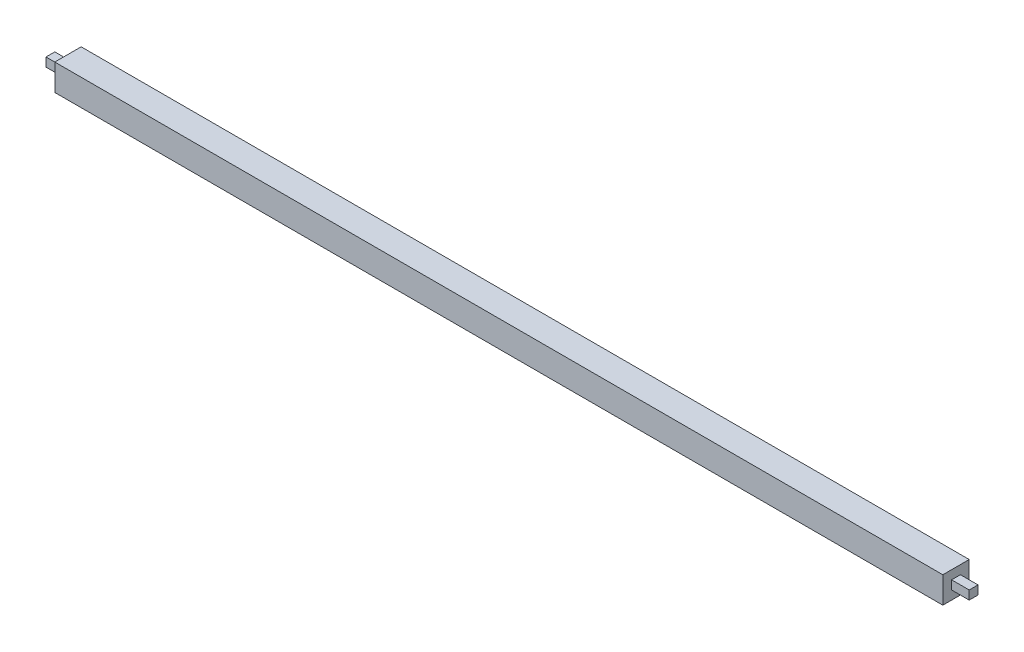
ISO-10303-21;
HEADER;
FILE_DESCRIPTION(('STEP AP214'),'2;1');
FILE_NAME('part.step','',(''),(''),'','','');
FILE_SCHEMA(('AUTOMOTIVE_DESIGN { 1 0 10303 214 1 1 1 1 }'));
ENDSEC;
DATA;
#1=APPLICATION_CONTEXT('core data for automotive mechanical design processes');
#2=APPLICATION_PROTOCOL_DEFINITION('international standard','automotive_design',2000,#1);
#3=PRODUCT_CONTEXT('',#1,'mechanical');
#4=PRODUCT('Part','Part','',(#3));
#5=PRODUCT_RELATED_PRODUCT_CATEGORY('part','',(#4));
#6=PRODUCT_DEFINITION_FORMATION('','',#4);
#7=PRODUCT_DEFINITION_CONTEXT('part definition',#1,'design');
#8=PRODUCT_DEFINITION('design','',#6,#7);
#9=PRODUCT_DEFINITION_SHAPE('','',#8);
#10=(LENGTH_UNIT() NAMED_UNIT(*) SI_UNIT(.MILLI.,.METRE.));
#11=(NAMED_UNIT(*) PLANE_ANGLE_UNIT() SI_UNIT($,.RADIAN.));
#12=(NAMED_UNIT(*) SI_UNIT($,.STERADIAN.) SOLID_ANGLE_UNIT());
#13=UNCERTAINTY_MEASURE_WITH_UNIT(LENGTH_MEASURE(1.E-05),#10,'distance_accuracy_value','');
#14=(GEOMETRIC_REPRESENTATION_CONTEXT(3) GLOBAL_UNCERTAINTY_ASSIGNED_CONTEXT((#13)) GLOBAL_UNIT_ASSIGNED_CONTEXT((#10,
#11,#12)) REPRESENTATION_CONTEXT('',''));
#15=CARTESIAN_POINT('',(0.,0.,0.));
#16=DIRECTION('',(0.,0.,1.));
#17=DIRECTION('',(1.,0.,0.));
#18=AXIS2_PLACEMENT_3D('',#15,#16,#17);
#19=CARTESIAN_POINT('',(202.,6.,0.));
#20=DIRECTION('',(-1.,0.,0.));
#21=DIRECTION('',(0.,0.,1.));
#22=AXIS2_PLACEMENT_3D('',#19,#20,#21);
#23=PLANE('',#22);
#24=DIRECTION('',(0.,0.,-1.));
#25=VECTOR('',#24,1.);
#26=CARTESIAN_POINT('',(202.,0.,0.));
#27=LINE('',#26,#25);
#28=CARTESIAN_POINT('',(202.,0.,0.));
#29=VERTEX_POINT('',#28);
#30=CARTESIAN_POINT('',(202.,0.,-6.00000000000003));
#31=VERTEX_POINT('',#30);
#32=EDGE_CURVE('E196',#29,#31,#27,.T.);
#33=ORIENTED_EDGE('',*,*,#32,.T.);
#34=DIRECTION('',(0.,-1.,0.));
#35=VECTOR('',#34,1.);
#36=CARTESIAN_POINT('',(202.,6.,-6.00000000000003));
#37=LINE('',#36,#35);
#38=CARTESIAN_POINT('',(202.,6.,-6.00000000000003));
#39=VERTEX_POINT('',#38);
#40=EDGE_CURVE('E201',#39,#31,#37,.T.);
#41=ORIENTED_EDGE('',*,*,#40,.F.);
#42=DIRECTION('',(0.,0.,-1.));
#43=VECTOR('',#42,1.);
#44=CARTESIAN_POINT('',(202.,6.,0.));
#45=LINE('',#44,#43);
#46=CARTESIAN_POINT('',(202.,6.,0.));
#47=VERTEX_POINT('',#46);
#48=EDGE_CURVE('E187',#47,#39,#45,.T.);
#49=ORIENTED_EDGE('',*,*,#48,.F.);
#50=DIRECTION('',(0.,-1.,0.));
#51=VECTOR('',#50,1.);
#52=CARTESIAN_POINT('',(202.,6.,0.));
#53=LINE('',#52,#51);
#54=EDGE_CURVE('E41',#47,#29,#53,.T.);
#55=ORIENTED_EDGE('',*,*,#54,.T.);
#56=EDGE_LOOP('',(#33,#41,#49,#55));
#57=FACE_BOUND('',#56,.T.);
#58=DIRECTION('',(0.,-1.,0.));
#59=VECTOR('',#58,1.);
#60=CARTESIAN_POINT('',(202.,4.,-2.00000000000003));
#61=LINE('',#60,#59);
#62=CARTESIAN_POINT('',(202.,4.,-2.00000000000003));
#63=VERTEX_POINT('',#62);
#64=CARTESIAN_POINT('',(202.,2.,-2.00000000000003));
#65=VERTEX_POINT('',#64);
#66=EDGE_CURVE('E48',#63,#65,#61,.T.);
#67=ORIENTED_EDGE('',*,*,#66,.F.);
#68=DIRECTION('',(0.,0.,1.));
#69=VECTOR('',#68,1.);
#70=CARTESIAN_POINT('',(202.,4.,-2.00000000000003));
#71=LINE('',#70,#69);
#72=CARTESIAN_POINT('',(202.,4.,-4.00000000000003));
#73=VERTEX_POINT('',#72);
#74=EDGE_CURVE('E52',#73,#63,#71,.T.);
#75=ORIENTED_EDGE('',*,*,#74,.F.);
#76=DIRECTION('',(0.,1.,0.));
#77=VECTOR('',#76,1.);
#78=CARTESIAN_POINT('',(202.,4.,-4.00000000000003));
#79=LINE('',#78,#77);
#80=CARTESIAN_POINT('',(202.,2.,-4.00000000000003));
#81=VERTEX_POINT('',#80);
#82=EDGE_CURVE('E368',#81,#73,#79,.T.);
#83=ORIENTED_EDGE('',*,*,#82,.F.);
#84=DIRECTION('',(0.,0.,-1.));
#85=VECTOR('',#84,1.);
#86=CARTESIAN_POINT('',(202.,2.,-2.00000000000003));
#87=LINE('',#86,#85);
#88=EDGE_CURVE('E374',#65,#81,#87,.T.);
#89=ORIENTED_EDGE('',*,*,#88,.F.);
#90=EDGE_LOOP('',(#67,#75,#83,#89));
#91=FACE_BOUND('',#90,.T.);
#92=ADVANCED_FACE('F33',(#57,#91),#23,.F.);
#93=CARTESIAN_POINT('',(0.,6.,-6.));
#94=DIRECTION('',(1.,0.,0.));
#95=DIRECTION('',(0.,0.,-1.));
#96=AXIS2_PLACEMENT_3D('',#93,#94,#95);
#97=PLANE('',#96);
#98=DIRECTION('',(0.,0.,1.));
#99=VECTOR('',#98,1.);
#100=CARTESIAN_POINT('',(0.,0.,-6.));
#101=LINE('',#100,#99);
#102=CARTESIAN_POINT('',(0.,0.,-6.));
#103=VERTEX_POINT('',#102);
#104=CARTESIAN_POINT('',(0.,0.,0.));
#105=VERTEX_POINT('',#104);
#106=EDGE_CURVE('E180',#103,#105,#101,.T.);
#107=ORIENTED_EDGE('',*,*,#106,.T.);
#108=DIRECTION('',(0.,-1.,0.));
#109=VECTOR('',#108,1.);
#110=CARTESIAN_POINT('',(0.,6.,0.));
#111=LINE('',#110,#109);
#112=CARTESIAN_POINT('',(0.,6.,0.));
#113=VERTEX_POINT('',#112);
#114=EDGE_CURVE('E11',#113,#105,#111,.T.);
#115=ORIENTED_EDGE('',*,*,#114,.F.);
#116=DIRECTION('',(0.,0.,1.));
#117=VECTOR('',#116,1.);
#118=CARTESIAN_POINT('',(0.,6.,-6.));
#119=LINE('',#118,#117);
#120=CARTESIAN_POINT('',(0.,6.,-6.));
#121=VERTEX_POINT('',#120);
#122=EDGE_CURVE('E181',#121,#113,#119,.T.);
#123=ORIENTED_EDGE('',*,*,#122,.F.);
#124=DIRECTION('',(0.,-1.,0.));
#125=VECTOR('',#124,1.);
#126=CARTESIAN_POINT('',(0.,6.,-6.));
#127=LINE('',#126,#125);
#128=EDGE_CURVE('E191',#121,#103,#127,.T.);
#129=ORIENTED_EDGE('',*,*,#128,.T.);
#130=EDGE_LOOP('',(#107,#115,#123,#129));
#131=FACE_BOUND('',#130,.T.);
#132=DIRECTION('',(0.,-1.,0.));
#133=VECTOR('',#132,1.);
#134=CARTESIAN_POINT('',(0.,4.,-4.));
#135=LINE('',#134,#133);
#136=CARTESIAN_POINT('',(0.,4.,-4.));
#137=VERTEX_POINT('',#136);
#138=CARTESIAN_POINT('',(0.,2.,-4.));
#139=VERTEX_POINT('',#138);
#140=EDGE_CURVE('E142',#137,#139,#135,.T.);
#141=ORIENTED_EDGE('',*,*,#140,.F.);
#142=DIRECTION('',(0.,0.,-1.));
#143=VECTOR('',#142,1.);
#144=CARTESIAN_POINT('',(0.,4.,-4.));
#145=LINE('',#144,#143);
#146=CARTESIAN_POINT('',(0.,4.,-2.));
#147=VERTEX_POINT('',#146);
#148=EDGE_CURVE('E155',#147,#137,#145,.T.);
#149=ORIENTED_EDGE('',*,*,#148,.F.);
#150=DIRECTION('',(0.,1.,0.));
#151=VECTOR('',#150,1.);
#152=CARTESIAN_POINT('',(0.,4.,-2.));
#153=LINE('',#152,#151);
#154=CARTESIAN_POINT('',(0.,2.,-2.));
#155=VERTEX_POINT('',#154);
#156=EDGE_CURVE('E164',#155,#147,#153,.T.);
#157=ORIENTED_EDGE('',*,*,#156,.F.);
#158=DIRECTION('',(0.,0.,1.));
#159=VECTOR('',#158,1.);
#160=CARTESIAN_POINT('',(0.,2.,-4.));
#161=LINE('',#160,#159);
#162=EDGE_CURVE('E145',#139,#155,#161,.T.);
#163=ORIENTED_EDGE('',*,*,#162,.F.);
#164=EDGE_LOOP('',(#141,#149,#157,#163));
#165=FACE_BOUND('',#164,.T.);
#166=ADVANCED_FACE('F35',(#131,#165),#97,.F.);
#167=CARTESIAN_POINT('',(0.,6.,0.));
#168=DIRECTION('',(0.,0.,-1.));
#169=DIRECTION('',(-1.,0.,0.));
#170=AXIS2_PLACEMENT_3D('',#167,#168,#169);
#171=PLANE('',#170);
#172=DIRECTION('',(1.,0.,0.));
#173=VECTOR('',#172,1.);
#174=CARTESIAN_POINT('',(0.,0.,0.));
#175=LINE('',#174,#173);
#176=EDGE_CURVE('E194',#105,#29,#175,.T.);
#177=ORIENTED_EDGE('',*,*,#176,.T.);
#178=ORIENTED_EDGE('',*,*,#54,.F.);
#179=DIRECTION('',(1.,0.,0.));
#180=VECTOR('',#179,1.);
#181=CARTESIAN_POINT('',(0.,6.,0.));
#182=LINE('',#181,#180);
#183=EDGE_CURVE('E184',#113,#47,#182,.T.);
#184=ORIENTED_EDGE('',*,*,#183,.F.);
#185=ORIENTED_EDGE('',*,*,#114,.T.);
#186=EDGE_LOOP('',(#177,#178,#184,#185));
#187=FACE_BOUND('',#186,.T.);
#188=ADVANCED_FACE('F224',(#187),#171,.F.);
#189=CARTESIAN_POINT('',(202.,6.,-6.00000000000003));
#190=DIRECTION('',(0.,0.,1.));
#191=DIRECTION('',(1.,0.,0.));
#192=AXIS2_PLACEMENT_3D('',#189,#190,#191);
#193=PLANE('',#192);
#194=DIRECTION('',(-1.,0.,0.));
#195=VECTOR('',#194,1.);
#196=CARTESIAN_POINT('',(202.,0.,-6.00000000000003));
#197=LINE('',#196,#195);
#198=EDGE_CURVE('E185',#31,#103,#197,.T.);
#199=ORIENTED_EDGE('',*,*,#198,.T.);
#200=ORIENTED_EDGE('',*,*,#128,.F.);
#201=DIRECTION('',(-1.,0.,0.));
#202=VECTOR('',#201,1.);
#203=CARTESIAN_POINT('',(202.,6.,-6.00000000000003));
#204=LINE('',#203,#202);
#205=EDGE_CURVE('E189',#39,#121,#204,.T.);
#206=ORIENTED_EDGE('',*,*,#205,.F.);
#207=ORIENTED_EDGE('',*,*,#40,.T.);
#208=EDGE_LOOP('',(#199,#200,#206,#207));
#209=FACE_BOUND('',#208,.T.);
#210=ADVANCED_FACE('F216',(#209),#193,.F.);
#211=CARTESIAN_POINT('',(0.,6.,0.));
#212=DIRECTION('',(0.,1.,0.));
#213=DIRECTION('',(0.,0.,1.));
#214=AXIS2_PLACEMENT_3D('',#211,#212,#213);
#215=PLANE('',#214);
#216=ORIENTED_EDGE('',*,*,#122,.T.);
#217=ORIENTED_EDGE('',*,*,#183,.T.);
#218=ORIENTED_EDGE('',*,*,#48,.T.);
#219=ORIENTED_EDGE('',*,*,#205,.T.);
#220=EDGE_LOOP('',(#216,#217,#218,#219));
#221=FACE_BOUND('',#220,.T.);
#222=ADVANCED_FACE('F223',(#221),#215,.T.);
#223=CARTESIAN_POINT('',(0.,0.,0.));
#224=DIRECTION('',(0.,1.,0.));
#225=DIRECTION('',(0.,0.,1.));
#226=AXIS2_PLACEMENT_3D('',#223,#224,#225);
#227=PLANE('',#226);
#228=ORIENTED_EDGE('',*,*,#106,.F.);
#229=ORIENTED_EDGE('',*,*,#198,.F.);
#230=ORIENTED_EDGE('',*,*,#32,.F.);
#231=ORIENTED_EDGE('',*,*,#176,.F.);
#232=EDGE_LOOP('',(#228,#229,#230,#231));
#233=FACE_BOUND('',#232,.T.);
#234=ADVANCED_FACE('F213',(#233),#227,.F.);
#235=CARTESIAN_POINT('',(-4.,4.,-4.));
#236=DIRECTION('',(0.,0.,1.));
#237=DIRECTION('',(1.,0.,0.));
#238=AXIS2_PLACEMENT_3D('',#235,#236,#237);
#239=PLANE('',#238);
#240=ORIENTED_EDGE('',*,*,#140,.T.);
#241=DIRECTION('',(1.,0.,0.));
#242=VECTOR('',#241,1.);
#243=CARTESIAN_POINT('',(-4.,2.,-4.));
#244=LINE('',#243,#242);
#245=CARTESIAN_POINT('',(-4.,2.,-4.));
#246=VERTEX_POINT('',#245);
#247=EDGE_CURVE('E177',#246,#139,#244,.T.);
#248=ORIENTED_EDGE('',*,*,#247,.F.);
#249=DIRECTION('',(0.,-1.,0.));
#250=VECTOR('',#249,1.);
#251=CARTESIAN_POINT('',(-4.,4.,-4.));
#252=LINE('',#251,#250);
#253=CARTESIAN_POINT('',(-4.,4.,-4.));
#254=VERTEX_POINT('',#253);
#255=EDGE_CURVE('E151',#254,#246,#252,.T.);
#256=ORIENTED_EDGE('',*,*,#255,.F.);
#257=DIRECTION('',(1.,0.,0.));
#258=VECTOR('',#257,1.);
#259=CARTESIAN_POINT('',(-4.,4.,-4.));
#260=LINE('',#259,#258);
#261=EDGE_CURVE('E160',#254,#137,#260,.T.);
#262=ORIENTED_EDGE('',*,*,#261,.T.);
#263=EDGE_LOOP('',(#240,#248,#256,#262));
#264=FACE_BOUND('',#263,.T.);
#265=ADVANCED_FACE('F238',(#264),#239,.F.);
#266=CARTESIAN_POINT('',(-4.,2.,-4.));
#267=DIRECTION('',(0.,1.,0.));
#268=DIRECTION('',(0.,0.,1.));
#269=AXIS2_PLACEMENT_3D('',#266,#267,#268);
#270=PLANE('',#269);
#271=ORIENTED_EDGE('',*,*,#162,.T.);
#272=DIRECTION('',(1.,0.,0.));
#273=VECTOR('',#272,1.);
#274=CARTESIAN_POINT('',(-4.,2.,-2.));
#275=LINE('',#274,#273);
#276=CARTESIAN_POINT('',(-4.,2.,-2.));
#277=VERTEX_POINT('',#276);
#278=EDGE_CURVE('E174',#277,#155,#275,.T.);
#279=ORIENTED_EDGE('',*,*,#278,.F.);
#280=DIRECTION('',(0.,0.,1.));
#281=VECTOR('',#280,1.);
#282=CARTESIAN_POINT('',(-4.,2.,-4.));
#283=LINE('',#282,#281);
#284=EDGE_CURVE('E154',#246,#277,#283,.T.);
#285=ORIENTED_EDGE('',*,*,#284,.F.);
#286=ORIENTED_EDGE('',*,*,#247,.T.);
#287=EDGE_LOOP('',(#271,#279,#285,#286));
#288=FACE_BOUND('',#287,.T.);
#289=ADVANCED_FACE('F243',(#288),#270,.F.);
#290=CARTESIAN_POINT('',(-4.,4.,-2.));
#291=DIRECTION('',(0.,0.,-1.));
#292=DIRECTION('',(0.,1.,0.));
#293=AXIS2_PLACEMENT_3D('',#290,#291,#292);
#294=PLANE('',#293);
#295=ORIENTED_EDGE('',*,*,#156,.T.);
#296=DIRECTION('',(1.,0.,0.));
#297=VECTOR('',#296,1.);
#298=CARTESIAN_POINT('',(-4.,4.,-2.));
#299=LINE('',#298,#297);
#300=CARTESIAN_POINT('',(-4.,4.,-2.));
#301=VERTEX_POINT('',#300);
#302=EDGE_CURVE('E171',#301,#147,#299,.T.);
#303=ORIENTED_EDGE('',*,*,#302,.F.);
#304=DIRECTION('',(0.,1.,0.));
#305=VECTOR('',#304,1.);
#306=CARTESIAN_POINT('',(-4.,4.,-2.));
#307=LINE('',#306,#305);
#308=EDGE_CURVE('E157',#277,#301,#307,.T.);
#309=ORIENTED_EDGE('',*,*,#308,.F.);
#310=ORIENTED_EDGE('',*,*,#278,.T.);
#311=EDGE_LOOP('',(#295,#303,#309,#310));
#312=FACE_BOUND('',#311,.T.);
#313=ADVANCED_FACE('F247',(#312),#294,.F.);
#314=CARTESIAN_POINT('',(-4.,4.,-4.));
#315=DIRECTION('',(0.,-1.,0.));
#316=DIRECTION('',(0.,0.,-1.));
#317=AXIS2_PLACEMENT_3D('',#314,#315,#316);
#318=PLANE('',#317);
#319=ORIENTED_EDGE('',*,*,#148,.T.);
#320=ORIENTED_EDGE('',*,*,#261,.F.);
#321=DIRECTION('',(0.,0.,-1.));
#322=VECTOR('',#321,1.);
#323=CARTESIAN_POINT('',(-4.,4.,-4.));
#324=LINE('',#323,#322);
#325=EDGE_CURVE('E159',#301,#254,#324,.T.);
#326=ORIENTED_EDGE('',*,*,#325,.F.);
#327=ORIENTED_EDGE('',*,*,#302,.T.);
#328=EDGE_LOOP('',(#319,#320,#326,#327));
#329=FACE_BOUND('',#328,.T.);
#330=ADVANCED_FACE('F251',(#329),#318,.F.);
#331=CARTESIAN_POINT('',(-4.,0.,0.));
#332=DIRECTION('',(-1.,0.,0.));
#333=DIRECTION('',(0.,0.,1.));
#334=AXIS2_PLACEMENT_3D('',#331,#332,#333);
#335=PLANE('',#334);
#336=ORIENTED_EDGE('',*,*,#255,.T.);
#337=ORIENTED_EDGE('',*,*,#284,.T.);
#338=ORIENTED_EDGE('',*,*,#308,.T.);
#339=ORIENTED_EDGE('',*,*,#325,.T.);
#340=EDGE_LOOP('',(#336,#337,#338,#339));
#341=FACE_BOUND('',#340,.T.);
#342=ADVANCED_FACE('F255',(#341),#335,.T.);
#343=CARTESIAN_POINT('',(206.,4.,-2.00000000000003));
#344=DIRECTION('',(0.,0.,-1.));
#345=DIRECTION('',(0.,1.,0.));
#346=AXIS2_PLACEMENT_3D('',#343,#344,#345);
#347=PLANE('',#346);
#348=ORIENTED_EDGE('',*,*,#66,.T.);
#349=DIRECTION('',(-1.,0.,0.));
#350=VECTOR('',#349,1.);
#351=CARTESIAN_POINT('',(206.,2.,-2.00000000000003));
#352=LINE('',#351,#350);
#353=CARTESIAN_POINT('',(206.,2.,-2.00000000000003));
#354=VERTEX_POINT('',#353);
#355=EDGE_CURVE('E125',#354,#65,#352,.T.);
#356=ORIENTED_EDGE('',*,*,#355,.F.);
#357=DIRECTION('',(0.,-1.,0.));
#358=VECTOR('',#357,1.);
#359=CARTESIAN_POINT('',(206.,4.,-2.00000000000003));
#360=LINE('',#359,#358);
#361=CARTESIAN_POINT('',(206.,4.,-2.00000000000003));
#362=VERTEX_POINT('',#361);
#363=EDGE_CURVE('E131',#362,#354,#360,.T.);
#364=ORIENTED_EDGE('',*,*,#363,.F.);
#365=DIRECTION('',(-1.,0.,0.));
#366=VECTOR('',#365,1.);
#367=CARTESIAN_POINT('',(206.,4.,-2.00000000000003));
#368=LINE('',#367,#366);
#369=EDGE_CURVE('E366',#362,#63,#368,.T.);
#370=ORIENTED_EDGE('',*,*,#369,.T.);
#371=EDGE_LOOP('',(#348,#356,#364,#370));
#372=FACE_BOUND('',#371,.T.);
#373=ADVANCED_FACE('F141',(#372),#347,.F.);
#374=CARTESIAN_POINT('',(206.,2.,-2.00000000000003));
#375=DIRECTION('',(0.,1.,0.));
#376=DIRECTION('',(0.,0.,1.));
#377=AXIS2_PLACEMENT_3D('',#374,#375,#376);
#378=PLANE('',#377);
#379=ORIENTED_EDGE('',*,*,#88,.T.);
#380=DIRECTION('',(-1.,0.,0.));
#381=VECTOR('',#380,1.);
#382=CARTESIAN_POINT('',(206.,2.,-4.00000000000003));
#383=LINE('',#382,#381);
#384=CARTESIAN_POINT('',(206.,2.,-4.00000000000003));
#385=VERTEX_POINT('',#384);
#386=EDGE_CURVE('E127',#385,#81,#383,.T.);
#387=ORIENTED_EDGE('',*,*,#386,.F.);
#388=DIRECTION('',(0.,0.,-1.));
#389=VECTOR('',#388,1.);
#390=CARTESIAN_POINT('',(206.,2.,-2.00000000000003));
#391=LINE('',#390,#389);
#392=EDGE_CURVE('E120',#354,#385,#391,.T.);
#393=ORIENTED_EDGE('',*,*,#392,.F.);
#394=ORIENTED_EDGE('',*,*,#355,.T.);
#395=EDGE_LOOP('',(#379,#387,#393,#394));
#396=FACE_BOUND('',#395,.T.);
#397=ADVANCED_FACE('F123',(#396),#378,.F.);
#398=CARTESIAN_POINT('',(206.,4.,-4.00000000000003));
#399=DIRECTION('',(0.,0.,1.));
#400=DIRECTION('',(1.,0.,0.));
#401=AXIS2_PLACEMENT_3D('',#398,#399,#400);
#402=PLANE('',#401);
#403=ORIENTED_EDGE('',*,*,#82,.T.);
#404=DIRECTION('',(-1.,0.,0.));
#405=VECTOR('',#404,1.);
#406=CARTESIAN_POINT('',(206.,4.,-4.00000000000003));
#407=LINE('',#406,#405);
#408=CARTESIAN_POINT('',(206.,4.,-4.00000000000003));
#409=VERTEX_POINT('',#408);
#410=EDGE_CURVE('E147',#409,#73,#407,.T.);
#411=ORIENTED_EDGE('',*,*,#410,.F.);
#412=DIRECTION('',(0.,1.,0.));
#413=VECTOR('',#412,1.);
#414=CARTESIAN_POINT('',(206.,4.,-4.00000000000003));
#415=LINE('',#414,#413);
#416=EDGE_CURVE('E130',#385,#409,#415,.T.);
#417=ORIENTED_EDGE('',*,*,#416,.F.);
#418=ORIENTED_EDGE('',*,*,#386,.T.);
#419=EDGE_LOOP('',(#403,#411,#417,#418));
#420=FACE_BOUND('',#419,.T.);
#421=ADVANCED_FACE('F264',(#420),#402,.F.);
#422=CARTESIAN_POINT('',(206.,4.,-2.00000000000003));
#423=DIRECTION('',(0.,-1.,0.));
#424=DIRECTION('',(0.,0.,-1.));
#425=AXIS2_PLACEMENT_3D('',#422,#423,#424);
#426=PLANE('',#425);
#427=ORIENTED_EDGE('',*,*,#74,.T.);
#428=ORIENTED_EDGE('',*,*,#369,.F.);
#429=DIRECTION('',(0.,0.,1.));
#430=VECTOR('',#429,1.);
#431=CARTESIAN_POINT('',(206.,4.,-2.00000000000003));
#432=LINE('',#431,#430);
#433=EDGE_CURVE('E136',#409,#362,#432,.T.);
#434=ORIENTED_EDGE('',*,*,#433,.F.);
#435=ORIENTED_EDGE('',*,*,#410,.T.);
#436=EDGE_LOOP('',(#427,#428,#434,#435));
#437=FACE_BOUND('',#436,.T.);
#438=ADVANCED_FACE('F267',(#437),#426,.F.);
#439=CARTESIAN_POINT('',(206.,0.,0.));
#440=DIRECTION('',(1.,0.,0.));
#441=DIRECTION('',(0.,0.,-1.));
#442=AXIS2_PLACEMENT_3D('',#439,#440,#441);
#443=PLANE('',#442);
#444=ORIENTED_EDGE('',*,*,#363,.T.);
#445=ORIENTED_EDGE('',*,*,#392,.T.);
#446=ORIENTED_EDGE('',*,*,#416,.T.);
#447=ORIENTED_EDGE('',*,*,#433,.T.);
#448=EDGE_LOOP('',(#444,#445,#446,#447));
#449=FACE_BOUND('',#448,.T.);
#450=ADVANCED_FACE('F134',(#449),#443,.T.);
#451=CLOSED_SHELL('',(#92,#166,#188,#210,#222,#234,#265,#289,#313,#330,#342,#373,#397,#421,#438,#450));
#452=MANIFOLD_SOLID_BREP('B2',#451);
#453=ADVANCED_BREP_SHAPE_REPRESENTATION('',(#18,#452),#14);
#454=SHAPE_DEFINITION_REPRESENTATION(#9,#453);
ENDSEC;
END-ISO-10303-21;
